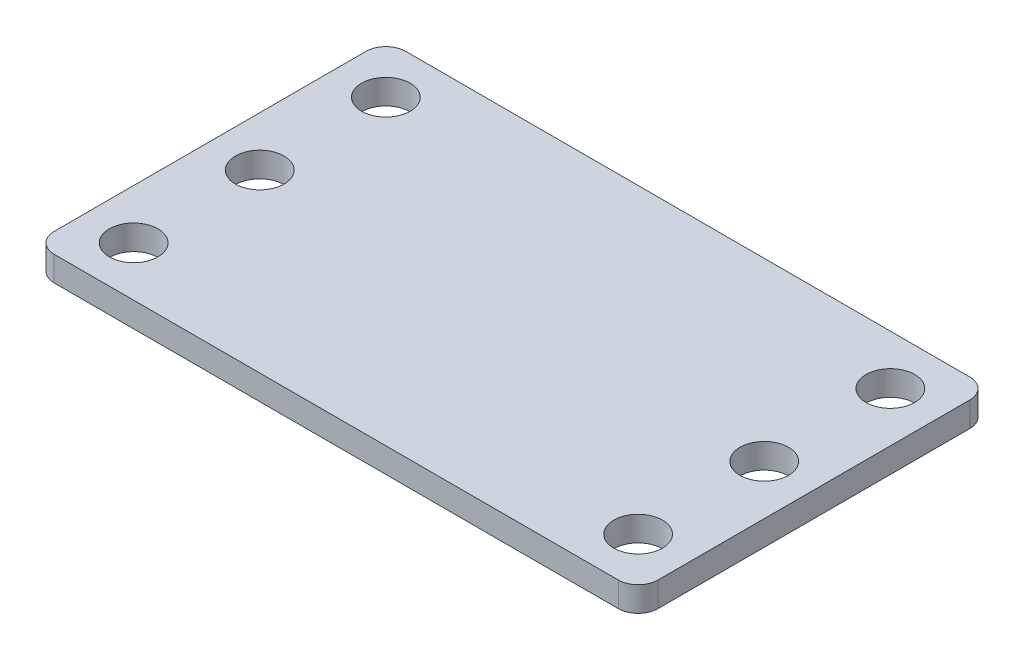
ISO-10303-21;
HEADER;
FILE_DESCRIPTION(('STEP AP214'),'2;1');
FILE_NAME('part.step','',(''),(''),'','','');
FILE_SCHEMA(('AUTOMOTIVE_DESIGN { 1 0 10303 214 1 1 1 1 }'));
ENDSEC;
DATA;
#1=APPLICATION_CONTEXT('core data for automotive mechanical design processes');
#2=APPLICATION_PROTOCOL_DEFINITION('international standard','automotive_design',2000,#1);
#3=PRODUCT_CONTEXT('',#1,'mechanical');
#4=PRODUCT('Part','Part','',(#3));
#5=PRODUCT_RELATED_PRODUCT_CATEGORY('part','',(#4));
#6=PRODUCT_DEFINITION_FORMATION('','',#4);
#7=PRODUCT_DEFINITION_CONTEXT('part definition',#1,'design');
#8=PRODUCT_DEFINITION('design','',#6,#7);
#9=PRODUCT_DEFINITION_SHAPE('','',#8);
#10=(LENGTH_UNIT() NAMED_UNIT(*) SI_UNIT(.MILLI.,.METRE.));
#11=(NAMED_UNIT(*) PLANE_ANGLE_UNIT() SI_UNIT($,.RADIAN.));
#12=(NAMED_UNIT(*) SI_UNIT($,.STERADIAN.) SOLID_ANGLE_UNIT());
#13=UNCERTAINTY_MEASURE_WITH_UNIT(LENGTH_MEASURE(1.E-05),#10,'distance_accuracy_value','');
#14=(GEOMETRIC_REPRESENTATION_CONTEXT(3) GLOBAL_UNCERTAINTY_ASSIGNED_CONTEXT((#13)) GLOBAL_UNIT_ASSIGNED_CONTEXT((#10,
#11,#12)) REPRESENTATION_CONTEXT('',''));
#15=CARTESIAN_POINT('',(0.,0.,0.));
#16=DIRECTION('',(0.,0.,1.));
#17=DIRECTION('',(1.,0.,0.));
#18=AXIS2_PLACEMENT_3D('',#15,#16,#17);
#19=CARTESIAN_POINT('',(0.,2.5,0.));
#20=DIRECTION('',(0.,1.,0.));
#21=DIRECTION('',(0.,0.,1.));
#22=AXIS2_PLACEMENT_3D('',#19,#20,#21);
#23=PLANE('',#22);
#24=CARTESIAN_POINT('',(25.4,2.5,0.));
#25=DIRECTION('',(0.,1.,0.));
#26=DIRECTION('',(0.,0.,-1.));
#27=AXIS2_PLACEMENT_3D('',#24,#25,#26);
#28=CIRCLE('',#27,2.45);
#29=CARTESIAN_POINT('',(25.4,2.5,-2.45));
#30=VERTEX_POINT('',#29);
#31=EDGE_CURVE('E210',#30,#30,#28,.T.);
#32=ORIENTED_EDGE('',*,*,#31,.F.);
#33=EDGE_LOOP('',(#32));
#34=FACE_BOUND('',#33,.T.);
#35=CARTESIAN_POINT('',(-25.4,2.5,12.7));
#36=DIRECTION('',(0.,1.,0.));
#37=DIRECTION('',(0.,0.,1.));
#38=AXIS2_PLACEMENT_3D('',#35,#36,#37);
#39=CIRCLE('',#38,2.45);
#40=CARTESIAN_POINT('',(-25.4,2.5,15.15));
#41=VERTEX_POINT('',#40);
#42=EDGE_CURVE('E198',#41,#41,#39,.T.);
#43=ORIENTED_EDGE('',*,*,#42,.F.);
#44=EDGE_LOOP('',(#43));
#45=FACE_BOUND('',#44,.T.);
#46=CARTESIAN_POINT('',(-25.4,2.5,-12.7));
#47=DIRECTION('',(0.,1.,0.));
#48=DIRECTION('',(0.,0.,1.));
#49=AXIS2_PLACEMENT_3D('',#46,#47,#48);
#50=CIRCLE('',#49,2.45);
#51=CARTESIAN_POINT('',(-25.4,2.5,-10.25));
#52=VERTEX_POINT('',#51);
#53=EDGE_CURVE('E188',#52,#52,#50,.T.);
#54=ORIENTED_EDGE('',*,*,#53,.F.);
#55=EDGE_LOOP('',(#54));
#56=FACE_BOUND('',#55,.T.);
#57=DIRECTION('',(-1.,0.,0.));
#58=VECTOR('',#57,1.);
#59=CARTESIAN_POINT('',(-30.4,2.5,-17.7));
#60=LINE('',#59,#58);
#61=CARTESIAN_POINT('',(28.4,2.5,-17.7));
#62=VERTEX_POINT('',#61);
#63=CARTESIAN_POINT('',(-28.4,2.5,-17.7));
#64=VERTEX_POINT('',#63);
#65=EDGE_CURVE('E179',#62,#64,#60,.T.);
#66=ORIENTED_EDGE('',*,*,#65,.T.);
#67=CARTESIAN_POINT('',(-28.4,2.5,-15.7));
#68=DIRECTION('',(0.,1.,0.));
#69=DIRECTION('',(0.,0.,1.));
#70=AXIS2_PLACEMENT_3D('',#67,#68,#69);
#71=CIRCLE('',#70,2.);
#72=CARTESIAN_POINT('',(-30.4,2.5,-15.7));
#73=VERTEX_POINT('',#72);
#74=EDGE_CURVE('E157',#64,#73,#71,.T.);
#75=ORIENTED_EDGE('',*,*,#74,.T.);
#76=DIRECTION('',(0.,0.,1.));
#77=VECTOR('',#76,1.);
#78=CARTESIAN_POINT('',(-30.4,2.5,-17.7));
#79=LINE('',#78,#77);
#80=CARTESIAN_POINT('',(-30.4,2.5,15.7));
#81=VERTEX_POINT('',#80);
#82=EDGE_CURVE('E127',#73,#81,#79,.T.);
#83=ORIENTED_EDGE('',*,*,#82,.T.);
#84=CARTESIAN_POINT('',(-28.4,2.5,15.7));
#85=DIRECTION('',(0.,1.,0.));
#86=DIRECTION('',(0.,0.,1.));
#87=AXIS2_PLACEMENT_3D('',#84,#85,#86);
#88=CIRCLE('',#87,2.);
#89=CARTESIAN_POINT('',(-28.4,2.5,17.7));
#90=VERTEX_POINT('',#89);
#91=EDGE_CURVE('E63',#81,#90,#88,.T.);
#92=ORIENTED_EDGE('',*,*,#91,.T.);
#93=DIRECTION('',(1.,0.,0.));
#94=VECTOR('',#93,1.);
#95=CARTESIAN_POINT('',(-30.4,2.5,17.7));
#96=LINE('',#95,#94);
#97=CARTESIAN_POINT('',(28.4,2.5,17.7));
#98=VERTEX_POINT('',#97);
#99=EDGE_CURVE('E143',#90,#98,#96,.T.);
#100=ORIENTED_EDGE('',*,*,#99,.T.);
#101=CARTESIAN_POINT('',(28.4,2.5,15.7));
#102=DIRECTION('',(0.,1.,0.));
#103=DIRECTION('',(0.,0.,1.));
#104=AXIS2_PLACEMENT_3D('',#101,#102,#103);
#105=CIRCLE('',#104,2.);
#106=CARTESIAN_POINT('',(30.4,2.5,15.7));
#107=VERTEX_POINT('',#106);
#108=EDGE_CURVE('E153',#98,#107,#105,.T.);
#109=ORIENTED_EDGE('',*,*,#108,.T.);
#110=DIRECTION('',(0.,0.,-1.));
#111=VECTOR('',#110,1.);
#112=CARTESIAN_POINT('',(30.4,2.5,-17.7));
#113=LINE('',#112,#111);
#114=CARTESIAN_POINT('',(30.4,2.5,-15.7));
#115=VERTEX_POINT('',#114);
#116=EDGE_CURVE('E137',#107,#115,#113,.T.);
#117=ORIENTED_EDGE('',*,*,#116,.T.);
#118=CARTESIAN_POINT('',(28.4,2.5,-15.7));
#119=DIRECTION('',(0.,1.,0.));
#120=DIRECTION('',(0.,0.,1.));
#121=AXIS2_PLACEMENT_3D('',#118,#119,#120);
#122=CIRCLE('',#121,2.);
#123=EDGE_CURVE('E155',#115,#62,#122,.T.);
#124=ORIENTED_EDGE('',*,*,#123,.T.);
#125=EDGE_LOOP('',(#66,#75,#83,#92,#100,#109,#117,#124));
#126=FACE_BOUND('',#125,.T.);
#127=CARTESIAN_POINT('',(-25.4,2.5,0.));
#128=DIRECTION('',(0.,1.,0.));
#129=DIRECTION('',(0.,0.,1.));
#130=AXIS2_PLACEMENT_3D('',#127,#128,#129);
#131=CIRCLE('',#130,2.45);
#132=CARTESIAN_POINT('',(-25.4,2.5,2.45));
#133=VERTEX_POINT('',#132);
#134=EDGE_CURVE('E193',#133,#133,#131,.T.);
#135=ORIENTED_EDGE('',*,*,#134,.F.);
#136=EDGE_LOOP('',(#135));
#137=FACE_BOUND('',#136,.T.);
#138=CARTESIAN_POINT('',(25.4,2.5,12.7));
#139=DIRECTION('',(0.,1.,0.));
#140=DIRECTION('',(0.,0.,-1.));
#141=AXIS2_PLACEMENT_3D('',#138,#139,#140);
#142=CIRCLE('',#141,2.45000000000001);
#143=CARTESIAN_POINT('',(25.4,2.5,10.25));
#144=VERTEX_POINT('',#143);
#145=EDGE_CURVE('E204',#144,#144,#142,.T.);
#146=ORIENTED_EDGE('',*,*,#145,.F.);
#147=EDGE_LOOP('',(#146));
#148=FACE_BOUND('',#147,.T.);
#149=CARTESIAN_POINT('',(25.4,2.5,-12.7));
#150=DIRECTION('',(0.,1.,0.));
#151=DIRECTION('',(0.,0.,-1.));
#152=AXIS2_PLACEMENT_3D('',#149,#150,#151);
#153=CIRCLE('',#152,2.44999999999999);
#154=CARTESIAN_POINT('',(25.4,2.5,-15.15));
#155=VERTEX_POINT('',#154);
#156=EDGE_CURVE('E216',#155,#155,#153,.T.);
#157=ORIENTED_EDGE('',*,*,#156,.F.);
#158=EDGE_LOOP('',(#157));
#159=FACE_BOUND('',#158,.T.);
#160=ADVANCED_FACE('F43',(#34,#45,#56,#126,#137,#148,#159),#23,.T.);
#161=CARTESIAN_POINT('',(0.,0.,0.));
#162=DIRECTION('',(0.,1.,0.));
#163=DIRECTION('',(0.,0.,1.));
#164=AXIS2_PLACEMENT_3D('',#161,#162,#163);
#165=PLANE('',#164);
#166=DIRECTION('',(0.,0.,1.));
#167=VECTOR('',#166,1.);
#168=CARTESIAN_POINT('',(-30.4,0.,-17.7));
#169=LINE('',#168,#167);
#170=CARTESIAN_POINT('',(-30.4,0.,-15.7));
#171=VERTEX_POINT('',#170);
#172=CARTESIAN_POINT('',(-30.4,0.,15.7));
#173=VERTEX_POINT('',#172);
#174=EDGE_CURVE('E125',#171,#173,#169,.T.);
#175=ORIENTED_EDGE('',*,*,#174,.F.);
#176=CARTESIAN_POINT('',(-28.4,0.,-15.7));
#177=DIRECTION('',(0.,1.,0.));
#178=DIRECTION('',(0.,0.,1.));
#179=AXIS2_PLACEMENT_3D('',#176,#177,#178);
#180=CIRCLE('',#179,2.);
#181=CARTESIAN_POINT('',(-28.4,0.,-17.7));
#182=VERTEX_POINT('',#181);
#183=EDGE_CURVE('E108',#171,#182,#180,.F.);
#184=ORIENTED_EDGE('',*,*,#183,.T.);
#185=DIRECTION('',(-1.,0.,0.));
#186=VECTOR('',#185,1.);
#187=CARTESIAN_POINT('',(-30.4,0.,-17.7));
#188=LINE('',#187,#186);
#189=CARTESIAN_POINT('',(28.4,0.,-17.7));
#190=VERTEX_POINT('',#189);
#191=EDGE_CURVE('E135',#190,#182,#188,.T.);
#192=ORIENTED_EDGE('',*,*,#191,.F.);
#193=CARTESIAN_POINT('',(28.4,0.,-15.7));
#194=DIRECTION('',(0.,1.,0.));
#195=DIRECTION('',(0.,0.,1.));
#196=AXIS2_PLACEMENT_3D('',#193,#194,#195);
#197=CIRCLE('',#196,2.);
#198=CARTESIAN_POINT('',(30.4,0.,-15.7));
#199=VERTEX_POINT('',#198);
#200=EDGE_CURVE('E119',#190,#199,#197,.F.);
#201=ORIENTED_EDGE('',*,*,#200,.T.);
#202=DIRECTION('',(0.,0.,-1.));
#203=VECTOR('',#202,1.);
#204=CARTESIAN_POINT('',(30.4,0.,-17.7));
#205=LINE('',#204,#203);
#206=CARTESIAN_POINT('',(30.4,0.,15.7));
#207=VERTEX_POINT('',#206);
#208=EDGE_CURVE('E139',#207,#199,#205,.T.);
#209=ORIENTED_EDGE('',*,*,#208,.F.);
#210=CARTESIAN_POINT('',(28.4,0.,15.7));
#211=DIRECTION('',(0.,1.,0.));
#212=DIRECTION('',(0.,0.,1.));
#213=AXIS2_PLACEMENT_3D('',#210,#211,#212);
#214=CIRCLE('',#213,2.);
#215=CARTESIAN_POINT('',(28.4,0.,17.7));
#216=VERTEX_POINT('',#215);
#217=EDGE_CURVE('E146',#207,#216,#214,.F.);
#218=ORIENTED_EDGE('',*,*,#217,.T.);
#219=DIRECTION('',(1.,0.,0.));
#220=VECTOR('',#219,1.);
#221=CARTESIAN_POINT('',(-30.4,0.,17.7));
#222=LINE('',#221,#220);
#223=CARTESIAN_POINT('',(-28.4,0.,17.7));
#224=VERTEX_POINT('',#223);
#225=EDGE_CURVE('E134',#224,#216,#222,.T.);
#226=ORIENTED_EDGE('',*,*,#225,.F.);
#227=CARTESIAN_POINT('',(-28.4,0.,15.7));
#228=DIRECTION('',(0.,1.,0.));
#229=DIRECTION('',(0.,0.,1.));
#230=AXIS2_PLACEMENT_3D('',#227,#228,#229);
#231=CIRCLE('',#230,2.);
#232=EDGE_CURVE('E128',#224,#173,#231,.F.);
#233=ORIENTED_EDGE('',*,*,#232,.T.);
#234=EDGE_LOOP('',(#175,#184,#192,#201,#209,#218,#226,#233));
#235=FACE_BOUND('',#234,.T.);
#236=CARTESIAN_POINT('',(-25.4,0.,-12.7));
#237=DIRECTION('',(0.,1.,0.));
#238=DIRECTION('',(0.,0.,1.));
#239=AXIS2_PLACEMENT_3D('',#236,#237,#238);
#240=CIRCLE('',#239,2.45);
#241=CARTESIAN_POINT('',(-25.4,0.,-10.25));
#242=VERTEX_POINT('',#241);
#243=EDGE_CURVE('E184',#242,#242,#240,.T.);
#244=ORIENTED_EDGE('',*,*,#243,.T.);
#245=EDGE_LOOP('',(#244));
#246=FACE_BOUND('',#245,.T.);
#247=CARTESIAN_POINT('',(-25.4,0.,0.));
#248=DIRECTION('',(0.,1.,0.));
#249=DIRECTION('',(0.,0.,1.));
#250=AXIS2_PLACEMENT_3D('',#247,#248,#249);
#251=CIRCLE('',#250,2.45);
#252=CARTESIAN_POINT('',(-25.4,0.,2.45));
#253=VERTEX_POINT('',#252);
#254=EDGE_CURVE('E195',#253,#253,#251,.T.);
#255=ORIENTED_EDGE('',*,*,#254,.T.);
#256=EDGE_LOOP('',(#255));
#257=FACE_BOUND('',#256,.T.);
#258=CARTESIAN_POINT('',(-25.4,0.,12.7));
#259=DIRECTION('',(0.,1.,0.));
#260=DIRECTION('',(0.,0.,1.));
#261=AXIS2_PLACEMENT_3D('',#258,#259,#260);
#262=CIRCLE('',#261,2.45);
#263=CARTESIAN_POINT('',(-25.4,0.,15.15));
#264=VERTEX_POINT('',#263);
#265=EDGE_CURVE('E201',#264,#264,#262,.T.);
#266=ORIENTED_EDGE('',*,*,#265,.T.);
#267=EDGE_LOOP('',(#266));
#268=FACE_BOUND('',#267,.T.);
#269=CARTESIAN_POINT('',(25.4,0.,12.7));
#270=DIRECTION('',(0.,1.,0.));
#271=DIRECTION('',(0.,0.,-1.));
#272=AXIS2_PLACEMENT_3D('',#269,#270,#271);
#273=CIRCLE('',#272,2.45000000000001);
#274=CARTESIAN_POINT('',(25.4,0.,10.25));
#275=VERTEX_POINT('',#274);
#276=EDGE_CURVE('E207',#275,#275,#273,.T.);
#277=ORIENTED_EDGE('',*,*,#276,.T.);
#278=EDGE_LOOP('',(#277));
#279=FACE_BOUND('',#278,.T.);
#280=CARTESIAN_POINT('',(25.4,0.,0.));
#281=DIRECTION('',(0.,1.,0.));
#282=DIRECTION('',(0.,0.,-1.));
#283=AXIS2_PLACEMENT_3D('',#280,#281,#282);
#284=CIRCLE('',#283,2.45);
#285=CARTESIAN_POINT('',(25.4,0.,-2.45));
#286=VERTEX_POINT('',#285);
#287=EDGE_CURVE('E213',#286,#286,#284,.T.);
#288=ORIENTED_EDGE('',*,*,#287,.T.);
#289=EDGE_LOOP('',(#288));
#290=FACE_BOUND('',#289,.T.);
#291=CARTESIAN_POINT('',(25.4,0.,-12.7));
#292=DIRECTION('',(0.,1.,0.));
#293=DIRECTION('',(0.,0.,-1.));
#294=AXIS2_PLACEMENT_3D('',#291,#292,#293);
#295=CIRCLE('',#294,2.44999999999999);
#296=CARTESIAN_POINT('',(25.4,0.,-15.15));
#297=VERTEX_POINT('',#296);
#298=EDGE_CURVE('E219',#297,#297,#295,.T.);
#299=ORIENTED_EDGE('',*,*,#298,.T.);
#300=EDGE_LOOP('',(#299));
#301=FACE_BOUND('',#300,.T.);
#302=ADVANCED_FACE('F131',(#235,#246,#257,#268,#279,#290,#301),#165,.F.);
#303=CARTESIAN_POINT('',(30.4,2.5,-17.7));
#304=DIRECTION('',(-1.,0.,0.));
#305=DIRECTION('',(0.,0.,1.));
#306=AXIS2_PLACEMENT_3D('',#303,#304,#305);
#307=PLANE('',#306);
#308=ORIENTED_EDGE('',*,*,#208,.T.);
#309=DIRECTION('',(0.,-1.,0.));
#310=VECTOR('',#309,1.);
#311=CARTESIAN_POINT('',(30.4,2.5,-15.7));
#312=LINE('',#311,#310);
#313=EDGE_CURVE('E162',#199,#115,#312,.F.);
#314=ORIENTED_EDGE('',*,*,#313,.T.);
#315=ORIENTED_EDGE('',*,*,#116,.F.);
#316=DIRECTION('',(0.,-1.,0.));
#317=VECTOR('',#316,1.);
#318=CARTESIAN_POINT('',(30.4,2.5,15.7));
#319=LINE('',#318,#317);
#320=EDGE_CURVE('E159',#107,#207,#319,.T.);
#321=ORIENTED_EDGE('',*,*,#320,.T.);
#322=EDGE_LOOP('',(#308,#314,#315,#321));
#323=FACE_BOUND('',#322,.T.);
#324=ADVANCED_FACE('F175',(#323),#307,.F.);
#325=CARTESIAN_POINT('',(-30.4,2.5,-17.7));
#326=DIRECTION('',(0.,0.,1.));
#327=DIRECTION('',(1.,0.,0.));
#328=AXIS2_PLACEMENT_3D('',#325,#326,#327);
#329=PLANE('',#328);
#330=ORIENTED_EDGE('',*,*,#191,.T.);
#331=DIRECTION('',(0.,-1.,0.));
#332=VECTOR('',#331,1.);
#333=CARTESIAN_POINT('',(-28.4,2.5,-17.7));
#334=LINE('',#333,#332);
#335=EDGE_CURVE('E113',#182,#64,#334,.F.);
#336=ORIENTED_EDGE('',*,*,#335,.T.);
#337=ORIENTED_EDGE('',*,*,#65,.F.);
#338=DIRECTION('',(0.,-1.,0.));
#339=VECTOR('',#338,1.);
#340=CARTESIAN_POINT('',(28.4,2.5,-17.7));
#341=LINE('',#340,#339);
#342=EDGE_CURVE('E118',#62,#190,#341,.T.);
#343=ORIENTED_EDGE('',*,*,#342,.T.);
#344=EDGE_LOOP('',(#330,#336,#337,#343));
#345=FACE_BOUND('',#344,.T.);
#346=ADVANCED_FACE('F246',(#345),#329,.F.);
#347=CARTESIAN_POINT('',(-30.4,2.5,-17.7));
#348=DIRECTION('',(1.,0.,0.));
#349=DIRECTION('',(0.,0.,-1.));
#350=AXIS2_PLACEMENT_3D('',#347,#348,#349);
#351=PLANE('',#350);
#352=ORIENTED_EDGE('',*,*,#82,.F.);
#353=DIRECTION('',(0.,-1.,0.));
#354=VECTOR('',#353,1.);
#355=CARTESIAN_POINT('',(-30.4,2.5,-15.7));
#356=LINE('',#355,#354);
#357=EDGE_CURVE('E112',#73,#171,#356,.T.);
#358=ORIENTED_EDGE('',*,*,#357,.T.);
#359=ORIENTED_EDGE('',*,*,#174,.T.);
#360=DIRECTION('',(0.,-1.,0.));
#361=VECTOR('',#360,1.);
#362=CARTESIAN_POINT('',(-30.4,2.5,15.7));
#363=LINE('',#362,#361);
#364=EDGE_CURVE('E129',#173,#81,#363,.F.);
#365=ORIENTED_EDGE('',*,*,#364,.T.);
#366=EDGE_LOOP('',(#352,#358,#359,#365));
#367=FACE_BOUND('',#366,.T.);
#368=ADVANCED_FACE('F124',(#367),#351,.F.);
#369=CARTESIAN_POINT('',(-30.4,2.5,17.7));
#370=DIRECTION('',(0.,0.,-1.));
#371=DIRECTION('',(-1.,0.,0.));
#372=AXIS2_PLACEMENT_3D('',#369,#370,#371);
#373=PLANE('',#372);
#374=ORIENTED_EDGE('',*,*,#225,.T.);
#375=DIRECTION('',(0.,-1.,0.));
#376=VECTOR('',#375,1.);
#377=CARTESIAN_POINT('',(28.4,2.5,17.7));
#378=LINE('',#377,#376);
#379=EDGE_CURVE('E11',#216,#98,#378,.F.);
#380=ORIENTED_EDGE('',*,*,#379,.T.);
#381=ORIENTED_EDGE('',*,*,#99,.F.);
#382=DIRECTION('',(0.,-1.,0.));
#383=VECTOR('',#382,1.);
#384=CARTESIAN_POINT('',(-28.4,2.5,17.7));
#385=LINE('',#384,#383);
#386=EDGE_CURVE('E51',#90,#224,#385,.T.);
#387=ORIENTED_EDGE('',*,*,#386,.T.);
#388=EDGE_LOOP('',(#374,#380,#381,#387));
#389=FACE_BOUND('',#388,.T.);
#390=ADVANCED_FACE('F165',(#389),#373,.F.);
#391=CARTESIAN_POINT('',(-25.4,2.5,-12.7));
#392=DIRECTION('',(0.,-1.,0.));
#393=DIRECTION('',(0.,0.,-1.));
#394=AXIS2_PLACEMENT_3D('',#391,#392,#393);
#395=CYLINDRICAL_SURFACE('',#394,2.45);
#396=ORIENTED_EDGE('',*,*,#53,.T.);
#397=EDGE_LOOP('',(#396));
#398=FACE_BOUND('',#397,.T.);
#399=ORIENTED_EDGE('',*,*,#243,.F.);
#400=EDGE_LOOP('',(#399));
#401=FACE_BOUND('',#400,.T.);
#402=ADVANCED_FACE('F239',(#398,#401),#395,.F.);
#403=CARTESIAN_POINT('',(-25.4,2.5,0.));
#404=DIRECTION('',(0.,-1.,0.));
#405=DIRECTION('',(0.,0.,-1.));
#406=AXIS2_PLACEMENT_3D('',#403,#404,#405);
#407=CYLINDRICAL_SURFACE('',#406,2.45);
#408=ORIENTED_EDGE('',*,*,#134,.T.);
#409=EDGE_LOOP('',(#408));
#410=FACE_BOUND('',#409,.T.);
#411=ORIENTED_EDGE('',*,*,#254,.F.);
#412=EDGE_LOOP('',(#411));
#413=FACE_BOUND('',#412,.T.);
#414=ADVANCED_FACE('F290',(#410,#413),#407,.F.);
#415=CARTESIAN_POINT('',(-25.4,2.5,12.7));
#416=DIRECTION('',(0.,-1.,0.));
#417=DIRECTION('',(0.,0.,-1.));
#418=AXIS2_PLACEMENT_3D('',#415,#416,#417);
#419=CYLINDRICAL_SURFACE('',#418,2.45);
#420=ORIENTED_EDGE('',*,*,#42,.T.);
#421=EDGE_LOOP('',(#420));
#422=FACE_BOUND('',#421,.T.);
#423=ORIENTED_EDGE('',*,*,#265,.F.);
#424=EDGE_LOOP('',(#423));
#425=FACE_BOUND('',#424,.T.);
#426=ADVANCED_FACE('F274',(#422,#425),#419,.F.);
#427=CARTESIAN_POINT('',(25.4,2.5,12.7));
#428=DIRECTION('',(0.,-1.,0.));
#429=DIRECTION('',(0.,0.,-1.));
#430=AXIS2_PLACEMENT_3D('',#427,#428,#429);
#431=CYLINDRICAL_SURFACE('',#430,2.45000000000001);
#432=ORIENTED_EDGE('',*,*,#145,.T.);
#433=EDGE_LOOP('',(#432));
#434=FACE_BOUND('',#433,.T.);
#435=ORIENTED_EDGE('',*,*,#276,.F.);
#436=EDGE_LOOP('',(#435));
#437=FACE_BOUND('',#436,.T.);
#438=ADVANCED_FACE('F270',(#434,#437),#431,.F.);
#439=CARTESIAN_POINT('',(25.4,2.5,0.));
#440=DIRECTION('',(0.,-1.,0.));
#441=DIRECTION('',(0.,0.,-1.));
#442=AXIS2_PLACEMENT_3D('',#439,#440,#441);
#443=CYLINDRICAL_SURFACE('',#442,2.45);
#444=ORIENTED_EDGE('',*,*,#31,.T.);
#445=EDGE_LOOP('',(#444));
#446=FACE_BOUND('',#445,.T.);
#447=ORIENTED_EDGE('',*,*,#287,.F.);
#448=EDGE_LOOP('',(#447));
#449=FACE_BOUND('',#448,.T.);
#450=ADVANCED_FACE('F273',(#446,#449),#443,.F.);
#451=CARTESIAN_POINT('',(25.4,2.5,-12.7));
#452=DIRECTION('',(0.,-1.,0.));
#453=DIRECTION('',(0.,0.,-1.));
#454=AXIS2_PLACEMENT_3D('',#451,#452,#453);
#455=CYLINDRICAL_SURFACE('',#454,2.44999999999999);
#456=ORIENTED_EDGE('',*,*,#156,.T.);
#457=EDGE_LOOP('',(#456));
#458=FACE_BOUND('',#457,.T.);
#459=ORIENTED_EDGE('',*,*,#298,.F.);
#460=EDGE_LOOP('',(#459));
#461=FACE_BOUND('',#460,.T.);
#462=ADVANCED_FACE('F225',(#458,#461),#455,.F.);
#463=CARTESIAN_POINT('',(-28.4,2.5,-15.7));
#464=DIRECTION('',(0.,-1.,0.));
#465=DIRECTION('',(0.,0.,-1.));
#466=AXIS2_PLACEMENT_3D('',#463,#464,#465);
#467=CYLINDRICAL_SURFACE('',#466,2.);
#468=ORIENTED_EDGE('',*,*,#74,.F.);
#469=ORIENTED_EDGE('',*,*,#335,.F.);
#470=ORIENTED_EDGE('',*,*,#183,.F.);
#471=ORIENTED_EDGE('',*,*,#357,.F.);
#472=EDGE_LOOP('',(#468,#469,#470,#471));
#473=FACE_BOUND('',#472,.T.);
#474=ADVANCED_FACE('F111',(#473),#467,.T.);
#475=CARTESIAN_POINT('',(28.4,2.5,-15.7));
#476=DIRECTION('',(0.,-1.,0.));
#477=DIRECTION('',(0.,0.,-1.));
#478=AXIS2_PLACEMENT_3D('',#475,#476,#477);
#479=CYLINDRICAL_SURFACE('',#478,2.);
#480=ORIENTED_EDGE('',*,*,#123,.F.);
#481=ORIENTED_EDGE('',*,*,#313,.F.);
#482=ORIENTED_EDGE('',*,*,#200,.F.);
#483=ORIENTED_EDGE('',*,*,#342,.F.);
#484=EDGE_LOOP('',(#480,#481,#482,#483));
#485=FACE_BOUND('',#484,.T.);
#486=ADVANCED_FACE('F254',(#485),#479,.T.);
#487=CARTESIAN_POINT('',(28.4,2.5,15.7));
#488=DIRECTION('',(0.,-1.,0.));
#489=DIRECTION('',(0.,0.,-1.));
#490=AXIS2_PLACEMENT_3D('',#487,#488,#489);
#491=CYLINDRICAL_SURFACE('',#490,2.);
#492=ORIENTED_EDGE('',*,*,#108,.F.);
#493=ORIENTED_EDGE('',*,*,#379,.F.);
#494=ORIENTED_EDGE('',*,*,#217,.F.);
#495=ORIENTED_EDGE('',*,*,#320,.F.);
#496=EDGE_LOOP('',(#492,#493,#494,#495));
#497=FACE_BOUND('',#496,.T.);
#498=ADVANCED_FACE('F172',(#497),#491,.T.);
#499=CARTESIAN_POINT('',(-28.4,2.5,15.7));
#500=DIRECTION('',(0.,-1.,0.));
#501=DIRECTION('',(0.,0.,-1.));
#502=AXIS2_PLACEMENT_3D('',#499,#500,#501);
#503=CYLINDRICAL_SURFACE('',#502,2.);
#504=ORIENTED_EDGE('',*,*,#91,.F.);
#505=ORIENTED_EDGE('',*,*,#364,.F.);
#506=ORIENTED_EDGE('',*,*,#232,.F.);
#507=ORIENTED_EDGE('',*,*,#386,.F.);
#508=EDGE_LOOP('',(#504,#505,#506,#507));
#509=FACE_BOUND('',#508,.T.);
#510=ADVANCED_FACE('F45',(#509),#503,.T.);
#511=CLOSED_SHELL('',(#160,#302,#324,#346,#368,#390,#402,#414,#426,#438,#450,#462,#474,#486,
#498,#510));
#512=MANIFOLD_SOLID_BREP('B2',#511);
#513=ADVANCED_BREP_SHAPE_REPRESENTATION('',(#18,#512),#14);
#514=SHAPE_DEFINITION_REPRESENTATION(#9,#513);
ENDSEC;
END-ISO-10303-21;
